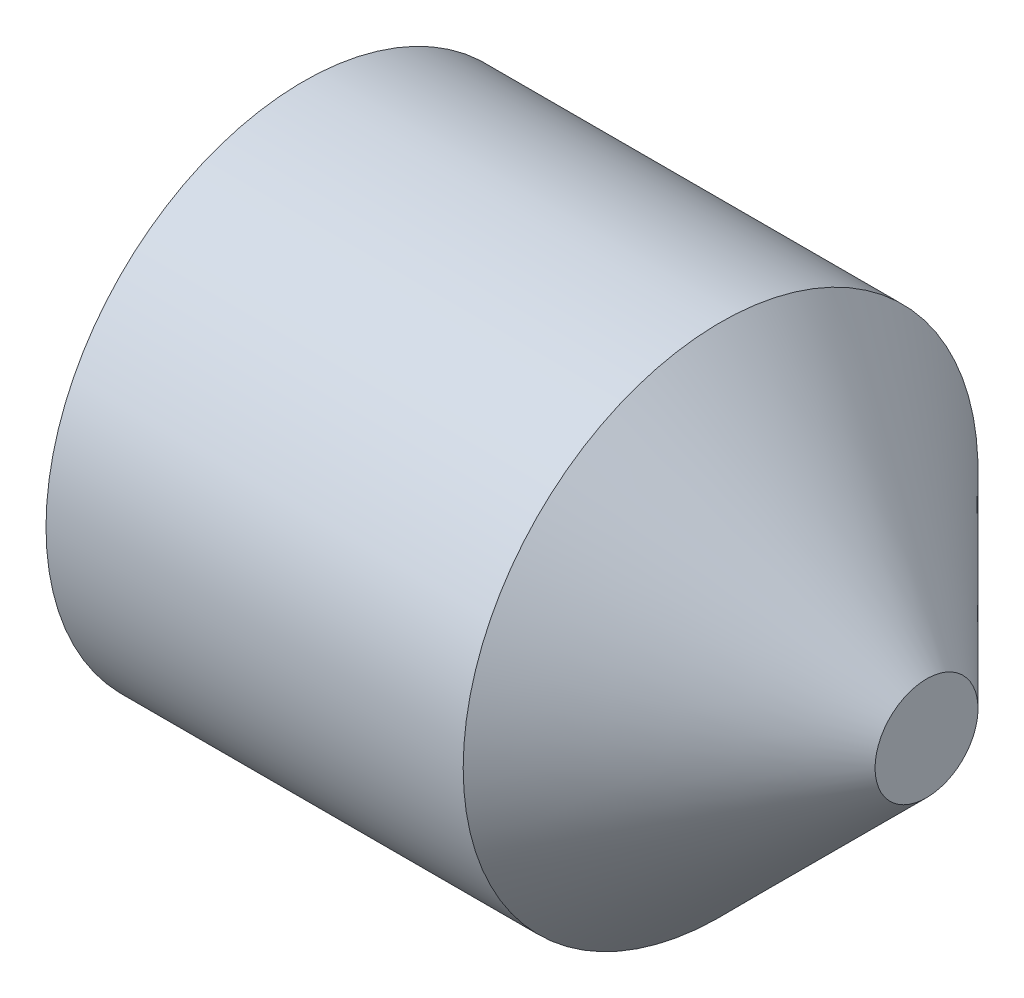
ISO-10303-21;
HEADER;
FILE_DESCRIPTION(('STEP AP214'),'2;1');
FILE_NAME('part.step','',(''),(''),'','','');
FILE_SCHEMA(('AUTOMOTIVE_DESIGN { 1 0 10303 214 1 1 1 1 }'));
ENDSEC;
DATA;
#1=APPLICATION_CONTEXT('core data for automotive mechanical design processes');
#2=APPLICATION_PROTOCOL_DEFINITION('international standard','automotive_design',2000,#1);
#3=PRODUCT_CONTEXT('',#1,'mechanical');
#4=PRODUCT('Part','Part','',(#3));
#5=PRODUCT_RELATED_PRODUCT_CATEGORY('part','',(#4));
#6=PRODUCT_DEFINITION_FORMATION('','',#4);
#7=PRODUCT_DEFINITION_CONTEXT('part definition',#1,'design');
#8=PRODUCT_DEFINITION('design','',#6,#7);
#9=PRODUCT_DEFINITION_SHAPE('','',#8);
#10=(LENGTH_UNIT() NAMED_UNIT(*) SI_UNIT(.MILLI.,.METRE.));
#11=(NAMED_UNIT(*) PLANE_ANGLE_UNIT() SI_UNIT($,.RADIAN.));
#12=(NAMED_UNIT(*) SI_UNIT($,.STERADIAN.) SOLID_ANGLE_UNIT());
#13=UNCERTAINTY_MEASURE_WITH_UNIT(LENGTH_MEASURE(1.E-05),#10,'distance_accuracy_value','');
#14=(GEOMETRIC_REPRESENTATION_CONTEXT(3) GLOBAL_UNCERTAINTY_ASSIGNED_CONTEXT((#13)) GLOBAL_UNIT_ASSIGNED_CONTEXT((#10,
#11,#12)) REPRESENTATION_CONTEXT('',''));
#15=CARTESIAN_POINT('',(0.,0.,0.));
#16=DIRECTION('',(0.,0.,1.));
#17=DIRECTION('',(1.,0.,0.));
#18=AXIS2_PLACEMENT_3D('',#15,#16,#17);
#19=CARTESIAN_POINT('',(0.,0.,0.));
#20=DIRECTION('',(-1.,0.,0.));
#21=DIRECTION('',(0.,0.,1.));
#22=AXIS2_PLACEMENT_3D('',#19,#20,#21);
#23=PLANE('',#22);
#24=CARTESIAN_POINT('',(0.,0.,0.));
#25=DIRECTION('',(-1.,0.,0.));
#26=DIRECTION('',(0.,0.,1.));
#27=AXIS2_PLACEMENT_3D('',#24,#25,#26);
#28=CIRCLE('',#27,10.352);
#29=CARTESIAN_POINT('',(0.,0.,10.352));
#30=VERTEX_POINT('',#29);
#31=EDGE_CURVE('E11',#30,#30,#28,.T.);
#32=ORIENTED_EDGE('',*,*,#31,.T.);
#33=EDGE_LOOP('',(#32));
#34=FACE_BOUND('',#33,.T.);
#35=DIRECTION('',(0.,0.,-1.));
#36=VECTOR('',#35,1.);
#37=CARTESIAN_POINT('',(0.,6.,3.46410161513775));
#38=LINE('',#37,#36);
#39=CARTESIAN_POINT('',(0.,6.,3.46410161513775));
#40=VERTEX_POINT('',#39);
#41=CARTESIAN_POINT('',(0.,6.,-3.46410161513776));
#42=VERTEX_POINT('',#41);
#43=EDGE_CURVE('E126',#40,#42,#38,.T.);
#44=ORIENTED_EDGE('',*,*,#43,.F.);
#45=DIRECTION('',(0.,-0.866025403784439,0.5));
#46=VECTOR('',#45,1.);
#47=CARTESIAN_POINT('',(0.,6.,3.46410161513775));
#48=LINE('',#47,#46);
#49=CARTESIAN_POINT('',(0.,0.,6.9282032302755));
#50=VERTEX_POINT('',#49);
#51=EDGE_CURVE('E48',#40,#50,#48,.T.);
#52=ORIENTED_EDGE('',*,*,#51,.T.);
#53=DIRECTION('',(0.,0.866025403784439,0.5));
#54=VECTOR('',#53,1.);
#55=CARTESIAN_POINT('',(0.,-5.99999999999999,3.46410161513775));
#56=LINE('',#55,#54);
#57=CARTESIAN_POINT('',(0.,-5.99999999999999,3.46410161513775));
#58=VERTEX_POINT('',#57);
#59=EDGE_CURVE('E117',#58,#50,#56,.T.);
#60=ORIENTED_EDGE('',*,*,#59,.F.);
#61=DIRECTION('',(0.,0.,-1.));
#62=VECTOR('',#61,1.);
#63=CARTESIAN_POINT('',(0.,-5.99999999999999,3.46410161513775));
#64=LINE('',#63,#62);
#65=CARTESIAN_POINT('',(0.,-5.99999999999999,-3.46410161513776));
#66=VERTEX_POINT('',#65);
#67=EDGE_CURVE('E120',#58,#66,#64,.T.);
#68=ORIENTED_EDGE('',*,*,#67,.T.);
#69=DIRECTION('',(0.,0.866025403784438,-0.5));
#70=VECTOR('',#69,1.);
#71=CARTESIAN_POINT('',(0.,-5.99999999999999,-3.46410161513776));
#72=LINE('',#71,#70);
#73=CARTESIAN_POINT('',(0.,0.,-6.92820323027551));
#74=VERTEX_POINT('',#73);
#75=EDGE_CURVE('E123',#66,#74,#72,.T.);
#76=ORIENTED_EDGE('',*,*,#75,.T.);
#77=DIRECTION('',(0.,-0.866025403784439,-0.5));
#78=VECTOR('',#77,1.);
#79=CARTESIAN_POINT('',(0.,6.,-3.46410161513776));
#80=LINE('',#79,#78);
#81=EDGE_CURVE('E106',#42,#74,#80,.T.);
#82=ORIENTED_EDGE('',*,*,#81,.F.);
#83=EDGE_LOOP('',(#44,#52,#60,#68,#76,#82));
#84=FACE_BOUND('',#83,.T.);
#85=ADVANCED_FACE('F34',(#34,#84),#23,.T.);
#86=CARTESIAN_POINT('',(0.,0.,0.));
#87=DIRECTION('',(1.,0.,0.));
#88=DIRECTION('',(0.,0.,-1.));
#89=AXIS2_PLACEMENT_3D('',#86,#87,#88);
#90=CONICAL_SURFACE('',#89,10.352,1.0471975511966);
#91=CARTESIAN_POINT('',(0.951473243624499,0.,0.));
#92=DIRECTION('',(-1.,0.,0.));
#93=DIRECTION('',(0.,0.,1.));
#94=AXIS2_PLACEMENT_3D('',#91,#92,#93);
#95=CIRCLE('',#94,12.);
#96=CARTESIAN_POINT('',(0.951473243624499,0.,12.));
#97=VERTEX_POINT('',#96);
#98=EDGE_CURVE('E41',#97,#97,#95,.T.);
#99=ORIENTED_EDGE('',*,*,#98,.T.);
#100=EDGE_LOOP('',(#99));
#101=FACE_BOUND('',#100,.T.);
#102=ORIENTED_EDGE('',*,*,#31,.F.);
#103=EDGE_LOOP('',(#102));
#104=FACE_BOUND('',#103,.T.);
#105=ADVANCED_FACE('F143',(#101,#104),#90,.T.);
#106=CARTESIAN_POINT('',(-12.7,0.,0.));
#107=DIRECTION('',(-1.,0.,0.));
#108=DIRECTION('',(0.,0.,1.));
#109=AXIS2_PLACEMENT_3D('',#106,#107,#108);
#110=CYLINDRICAL_SURFACE('',#109,12.);
#111=CARTESIAN_POINT('',(20.4,0.,0.));
#112=DIRECTION('',(-1.,0.,0.));
#113=DIRECTION('',(0.,0.,1.));
#114=AXIS2_PLACEMENT_3D('',#111,#112,#113);
#115=CIRCLE('',#114,12.);
#116=CARTESIAN_POINT('',(20.4,0.,12.));
#117=VERTEX_POINT('',#116);
#118=EDGE_CURVE('E138',#117,#117,#115,.T.);
#119=ORIENTED_EDGE('',*,*,#118,.T.);
#120=EDGE_LOOP('',(#119));
#121=FACE_BOUND('',#120,.T.);
#122=ORIENTED_EDGE('',*,*,#98,.F.);
#123=EDGE_LOOP('',(#122));
#124=FACE_BOUND('',#123,.T.);
#125=ADVANCED_FACE('F146',(#121,#124),#110,.T.);
#126=CARTESIAN_POINT('',(30.,0.,0.));
#127=DIRECTION('',(-1.,0.,0.));
#128=DIRECTION('',(0.,0.,1.));
#129=AXIS2_PLACEMENT_3D('',#126,#127,#128);
#130=CONICAL_SURFACE('',#129,2.4,0.78539816339745);
#131=CARTESIAN_POINT('',(30.,0.,0.));
#132=DIRECTION('',(-1.,0.,0.));
#133=DIRECTION('',(0.,0.,1.));
#134=AXIS2_PLACEMENT_3D('',#131,#132,#133);
#135=CIRCLE('',#134,2.4);
#136=CARTESIAN_POINT('',(30.,0.,2.4));
#137=VERTEX_POINT('',#136);
#138=EDGE_CURVE('E135',#137,#137,#135,.T.);
#139=CARTESIAN_POINT('',(20.4,0.,12.));
#140=CARTESIAN_POINT('',(20.5,0.,11.9));
#141=CARTESIAN_POINT('',(20.6,0.,11.8));
#142=CARTESIAN_POINT('',(20.8,0.,11.6));
#143=CARTESIAN_POINT('',(20.9,0.,11.5));
#144=CARTESIAN_POINT('',(21.1,0.,11.3));
#145=CARTESIAN_POINT('',(21.2,0.,11.2));
#146=CARTESIAN_POINT('',(21.4,0.,11.));
#147=CARTESIAN_POINT('',(21.5,0.,10.9));
#148=CARTESIAN_POINT('',(21.7,0.,10.7));
#149=CARTESIAN_POINT('',(21.8,0.,10.6));
#150=CARTESIAN_POINT('',(22.,0.,10.4));
#151=CARTESIAN_POINT('',(22.1,0.,10.3));
#152=CARTESIAN_POINT('',(22.3,0.,10.1));
#153=CARTESIAN_POINT('',(22.4,0.,10.));
#154=CARTESIAN_POINT('',(22.6,0.,9.8));
#155=CARTESIAN_POINT('',(22.7,0.,9.7));
#156=CARTESIAN_POINT('',(22.9,0.,9.5));
#157=CARTESIAN_POINT('',(23.,0.,9.4));
#158=CARTESIAN_POINT('',(23.2,0.,9.2));
#159=CARTESIAN_POINT('',(23.3,0.,9.1));
#160=CARTESIAN_POINT('',(23.5,0.,8.9));
#161=CARTESIAN_POINT('',(23.6,0.,8.8));
#162=CARTESIAN_POINT('',(23.8,0.,8.6));
#163=CARTESIAN_POINT('',(23.9,0.,8.5));
#164=CARTESIAN_POINT('',(24.1,0.,8.3));
#165=CARTESIAN_POINT('',(24.2,0.,8.2));
#166=CARTESIAN_POINT('',(24.4,0.,8.));
#167=CARTESIAN_POINT('',(24.5,0.,7.9));
#168=CARTESIAN_POINT('',(24.7,0.,7.7));
#169=CARTESIAN_POINT('',(24.8,0.,7.6));
#170=CARTESIAN_POINT('',(25.,0.,7.4));
#171=CARTESIAN_POINT('',(25.1,0.,7.3));
#172=CARTESIAN_POINT('',(25.3,0.,7.1));
#173=CARTESIAN_POINT('',(25.4,0.,7.));
#174=CARTESIAN_POINT('',(25.6,0.,6.8));
#175=CARTESIAN_POINT('',(25.7,0.,6.7));
#176=CARTESIAN_POINT('',(25.9,0.,6.5));
#177=CARTESIAN_POINT('',(26.,0.,6.4));
#178=CARTESIAN_POINT('',(26.2,0.,6.2));
#179=CARTESIAN_POINT('',(26.3,0.,6.1));
#180=CARTESIAN_POINT('',(26.5,0.,5.9));
#181=CARTESIAN_POINT('',(26.6,0.,5.8));
#182=CARTESIAN_POINT('',(26.8,0.,5.6));
#183=CARTESIAN_POINT('',(26.9,0.,5.5));
#184=CARTESIAN_POINT('',(27.1,0.,5.3));
#185=CARTESIAN_POINT('',(27.2,0.,5.2));
#186=CARTESIAN_POINT('',(27.4,0.,5.));
#187=CARTESIAN_POINT('',(27.5,0.,4.9));
#188=CARTESIAN_POINT('',(27.7,0.,4.7));
#189=CARTESIAN_POINT('',(27.8,0.,4.6));
#190=CARTESIAN_POINT('',(28.,0.,4.4));
#191=CARTESIAN_POINT('',(28.1,0.,4.3));
#192=CARTESIAN_POINT('',(28.3,0.,4.1));
#193=CARTESIAN_POINT('',(28.4,0.,4.));
#194=CARTESIAN_POINT('',(28.6,0.,3.8));
#195=CARTESIAN_POINT('',(28.7,0.,3.7));
#196=CARTESIAN_POINT('',(28.9,0.,3.5));
#197=CARTESIAN_POINT('',(29.,0.,3.4));
#198=CARTESIAN_POINT('',(29.2,0.,3.2));
#199=CARTESIAN_POINT('',(29.3,0.,3.1));
#200=CARTESIAN_POINT('',(29.5,0.,2.9));
#201=CARTESIAN_POINT('',(29.6,0.,2.8));
#202=CARTESIAN_POINT('',(29.8,0.,2.6));
#203=CARTESIAN_POINT('',(29.9,0.,2.5));
#204=CARTESIAN_POINT('',(30.,0.,2.4));
#205=B_SPLINE_CURVE_WITH_KNOTS('',3,(#139,#140,#141,#142,#143,#144,#145,#146,#147,#148,#149,
#150,#151,#152,#153,#154,#155,#156,#157,#158,#159,#160,#161,#162,#163,#164,#165,#166,#167,#168,
#169,#170,#171,#172,#173,#174,#175,#176,#177,#178,#179,#180,#181,#182,#183,#184,#185,#186,#187,
#188,#189,#190,#191,#192,#193,#194,#195,#196,#197,#198,#199,#200,#201,#202,#203,#204),
.UNSPECIFIED.,.F.,.F.,(4,2,2,2,2,2,2,2,2,2,2,2,2,2,2,2,2,2,2,2,2,2,2,2,2,2,2,2,2,2,2,2,4),(0.,
0.424264068711927,0.848528137423857,1.27279220613578,1.69705627484771,2.12132034355964,
2.54558441227157,2.96984848098349,3.39411254969542,3.81837661840735,4.24264068711928,
4.66690475583121,5.09116882454313,5.51543289325506,5.93969696196699,6.36396103067891,
6.78822509939084,7.21248916810277,7.6367532368147,8.06101730552662,8.48528137423855,
8.90954544295048,9.33380951166241,9.75807358037433,10.1823376490863,10.6066017177982,
11.0308657865101,11.455129855222,11.879393923934,12.3036579926459,12.7279220613578,
13.1521861300698,13.5764501987817),.UNSPECIFIED.);
#206=EDGE_CURVE('BSEAM148',#117,#137,#205,.T.);
#207=ORIENTED_EDGE('',*,*,#118,.F.);
#208=ORIENTED_EDGE('',*,*,#138,.T.);
#209=ORIENTED_EDGE('',*,*,#206,.T.);
#210=ORIENTED_EDGE('',*,*,#206,.F.);
#211=EDGE_LOOP('',(#207,#209,#208,#210));
#212=FACE_BOUND('',#211,.T.);
#213=ADVANCED_FACE('F148',(#212),#130,.T.);
#214=CARTESIAN_POINT('',(30.,0.,0.));
#215=DIRECTION('',(-1.,0.,0.));
#216=DIRECTION('',(0.,0.,1.));
#217=AXIS2_PLACEMENT_3D('',#214,#215,#216);
#218=PLANE('',#217);
#219=ORIENTED_EDGE('',*,*,#138,.F.);
#220=EDGE_LOOP('',(#219));
#221=FACE_BOUND('',#220,.T.);
#222=ADVANCED_FACE('F155',(#221),#218,.F.);
#223=CARTESIAN_POINT('',(10.,6.,3.46410161513775));
#224=DIRECTION('',(0.,-0.5,-0.866025403784439));
#225=DIRECTION('',(0.,0.866025403784439,-0.5));
#226=AXIS2_PLACEMENT_3D('',#223,#224,#225);
#227=PLANE('',#226);
#228=ORIENTED_EDGE('',*,*,#51,.F.);
#229=DIRECTION('',(-1.,0.,0.));
#230=VECTOR('',#229,1.);
#231=CARTESIAN_POINT('',(10.,6.,3.46410161513775));
#232=LINE('',#231,#230);
#233=CARTESIAN_POINT('',(10.,6.,3.46410161513775));
#234=VERTEX_POINT('',#233);
#235=EDGE_CURVE('E53',#234,#40,#232,.T.);
#236=ORIENTED_EDGE('',*,*,#235,.F.);
#237=DIRECTION('',(0.,-0.866025403784439,0.5));
#238=VECTOR('',#237,1.);
#239=CARTESIAN_POINT('',(10.,6.,3.46410161513775));
#240=LINE('',#239,#238);
#241=CARTESIAN_POINT('',(10.,0.,6.9282032302755));
#242=VERTEX_POINT('',#241);
#243=EDGE_CURVE('E80',#234,#242,#240,.T.);
#244=ORIENTED_EDGE('',*,*,#243,.T.);
#245=DIRECTION('',(-1.,0.,0.));
#246=VECTOR('',#245,1.);
#247=CARTESIAN_POINT('',(10.,0.,6.9282032302755));
#248=LINE('',#247,#246);
#249=EDGE_CURVE('E133',#242,#50,#248,.T.);
#250=ORIENTED_EDGE('',*,*,#249,.T.);
#251=EDGE_LOOP('',(#228,#236,#244,#250));
#252=FACE_BOUND('',#251,.T.);
#253=ADVANCED_FACE('F186',(#252),#227,.T.);
#254=CARTESIAN_POINT('',(10.,-5.99999999999999,3.46410161513775));
#255=DIRECTION('',(0.,-0.5,0.866025403784439));
#256=DIRECTION('',(0.,-0.866025403784439,-0.5));
#257=AXIS2_PLACEMENT_3D('',#254,#255,#256);
#258=PLANE('',#257);
#259=ORIENTED_EDGE('',*,*,#59,.T.);
#260=ORIENTED_EDGE('',*,*,#249,.F.);
#261=DIRECTION('',(0.,0.866025403784439,0.5));
#262=VECTOR('',#261,1.);
#263=CARTESIAN_POINT('',(10.,-5.99999999999999,3.46410161513775));
#264=LINE('',#263,#262);
#265=CARTESIAN_POINT('',(10.,-5.99999999999999,3.46410161513775));
#266=VERTEX_POINT('',#265);
#267=EDGE_CURVE('E265',#266,#242,#264,.T.);
#268=ORIENTED_EDGE('',*,*,#267,.F.);
#269=DIRECTION('',(-1.,0.,0.));
#270=VECTOR('',#269,1.);
#271=CARTESIAN_POINT('',(10.,-5.99999999999999,3.46410161513775));
#272=LINE('',#271,#270);
#273=EDGE_CURVE('E131',#266,#58,#272,.T.);
#274=ORIENTED_EDGE('',*,*,#273,.T.);
#275=EDGE_LOOP('',(#259,#260,#268,#274));
#276=FACE_BOUND('',#275,.T.);
#277=ADVANCED_FACE('F182',(#276),#258,.F.);
#278=CARTESIAN_POINT('',(10.,-5.99999999999999,3.46410161513775));
#279=DIRECTION('',(0.,1.,0.));
#280=DIRECTION('',(0.,0.,1.));
#281=AXIS2_PLACEMENT_3D('',#278,#279,#280);
#282=PLANE('',#281);
#283=ORIENTED_EDGE('',*,*,#67,.F.);
#284=ORIENTED_EDGE('',*,*,#273,.F.);
#285=DIRECTION('',(0.,0.,-1.));
#286=VECTOR('',#285,1.);
#287=CARTESIAN_POINT('',(10.,-5.99999999999999,3.46410161513775));
#288=LINE('',#287,#286);
#289=CARTESIAN_POINT('',(10.,-5.99999999999999,-3.46410161513776));
#290=VERTEX_POINT('',#289);
#291=EDGE_CURVE('E101',#266,#290,#288,.T.);
#292=ORIENTED_EDGE('',*,*,#291,.T.);
#293=DIRECTION('',(-1.,0.,0.));
#294=VECTOR('',#293,1.);
#295=CARTESIAN_POINT('',(10.,-5.99999999999999,-3.46410161513776));
#296=LINE('',#295,#294);
#297=EDGE_CURVE('E96',#290,#66,#296,.T.);
#298=ORIENTED_EDGE('',*,*,#297,.T.);
#299=EDGE_LOOP('',(#283,#284,#292,#298));
#300=FACE_BOUND('',#299,.T.);
#301=ADVANCED_FACE('F179',(#300),#282,.T.);
#302=CARTESIAN_POINT('',(10.,-5.99999999999999,-3.46410161513776));
#303=DIRECTION('',(0.,0.5,0.866025403784438));
#304=DIRECTION('',(0.,-0.866025403784439,0.5));
#305=AXIS2_PLACEMENT_3D('',#302,#303,#304);
#306=PLANE('',#305);
#307=ORIENTED_EDGE('',*,*,#75,.F.);
#308=ORIENTED_EDGE('',*,*,#297,.F.);
#309=DIRECTION('',(0.,0.866025403784438,-0.5));
#310=VECTOR('',#309,1.);
#311=CARTESIAN_POINT('',(10.,-5.99999999999999,-3.46410161513776));
#312=LINE('',#311,#310);
#313=CARTESIAN_POINT('',(10.,0.,-6.92820323027551));
#314=VERTEX_POINT('',#313);
#315=EDGE_CURVE('E91',#290,#314,#312,.T.);
#316=ORIENTED_EDGE('',*,*,#315,.T.);
#317=DIRECTION('',(-1.,0.,0.));
#318=VECTOR('',#317,1.);
#319=CARTESIAN_POINT('',(10.,0.,-6.92820323027551));
#320=LINE('',#319,#318);
#321=EDGE_CURVE('E95',#314,#74,#320,.T.);
#322=ORIENTED_EDGE('',*,*,#321,.T.);
#323=EDGE_LOOP('',(#307,#308,#316,#322));
#324=FACE_BOUND('',#323,.T.);
#325=ADVANCED_FACE('F94',(#324),#306,.T.);
#326=CARTESIAN_POINT('',(10.,6.,-3.46410161513776));
#327=DIRECTION('',(0.,0.5,-0.866025403784439));
#328=DIRECTION('',(0.,0.866025403784439,0.5));
#329=AXIS2_PLACEMENT_3D('',#326,#327,#328);
#330=PLANE('',#329);
#331=ORIENTED_EDGE('',*,*,#81,.T.);
#332=ORIENTED_EDGE('',*,*,#321,.F.);
#333=DIRECTION('',(0.,-0.866025403784439,-0.5));
#334=VECTOR('',#333,1.);
#335=CARTESIAN_POINT('',(10.,6.,-3.46410161513776));
#336=LINE('',#335,#334);
#337=CARTESIAN_POINT('',(10.,6.,-3.46410161513776));
#338=VERTEX_POINT('',#337);
#339=EDGE_CURVE('E100',#338,#314,#336,.T.);
#340=ORIENTED_EDGE('',*,*,#339,.F.);
#341=DIRECTION('',(-1.,0.,0.));
#342=VECTOR('',#341,1.);
#343=CARTESIAN_POINT('',(10.,6.,-3.46410161513776));
#344=LINE('',#343,#342);
#345=EDGE_CURVE('E76',#338,#42,#344,.T.);
#346=ORIENTED_EDGE('',*,*,#345,.T.);
#347=EDGE_LOOP('',(#331,#332,#340,#346));
#348=FACE_BOUND('',#347,.T.);
#349=ADVANCED_FACE('F103',(#348),#330,.F.);
#350=CARTESIAN_POINT('',(10.,6.,3.46410161513775));
#351=DIRECTION('',(0.,1.,0.));
#352=DIRECTION('',(0.,0.,1.));
#353=AXIS2_PLACEMENT_3D('',#350,#351,#352);
#354=PLANE('',#353);
#355=ORIENTED_EDGE('',*,*,#43,.T.);
#356=ORIENTED_EDGE('',*,*,#345,.F.);
#357=DIRECTION('',(0.,0.,-1.));
#358=VECTOR('',#357,1.);
#359=CARTESIAN_POINT('',(10.,6.,3.46410161513775));
#360=LINE('',#359,#358);
#361=EDGE_CURVE('E111',#234,#338,#360,.T.);
#362=ORIENTED_EDGE('',*,*,#361,.F.);
#363=ORIENTED_EDGE('',*,*,#235,.T.);
#364=EDGE_LOOP('',(#355,#356,#362,#363));
#365=FACE_BOUND('',#364,.T.);
#366=ADVANCED_FACE('F167',(#365),#354,.F.);
#367=CARTESIAN_POINT('',(10.,6.,3.46410161513775));
#368=DIRECTION('',(1.,0.,0.));
#369=DIRECTION('',(0.,0.,-1.));
#370=AXIS2_PLACEMENT_3D('',#367,#368,#369);
#371=PLANE('',#370);
#372=ORIENTED_EDGE('',*,*,#243,.F.);
#373=ORIENTED_EDGE('',*,*,#361,.T.);
#374=ORIENTED_EDGE('',*,*,#339,.T.);
#375=ORIENTED_EDGE('',*,*,#315,.F.);
#376=ORIENTED_EDGE('',*,*,#291,.F.);
#377=ORIENTED_EDGE('',*,*,#267,.T.);
#378=EDGE_LOOP('',(#372,#373,#374,#375,#376,#377));
#379=FACE_BOUND('',#378,.T.);
#380=ADVANCED_FACE('F109',(#379),#371,.F.);
#381=CLOSED_SHELL('',(#85,#105,#125,#213,#222,#253,#277,#301,#325,#349,#366,#380));
#382=MANIFOLD_SOLID_BREP('B2',#381);
#383=ADVANCED_BREP_SHAPE_REPRESENTATION('',(#18,#382),#14);
#384=SHAPE_DEFINITION_REPRESENTATION(#9,#383);
ENDSEC;
END-ISO-10303-21;
